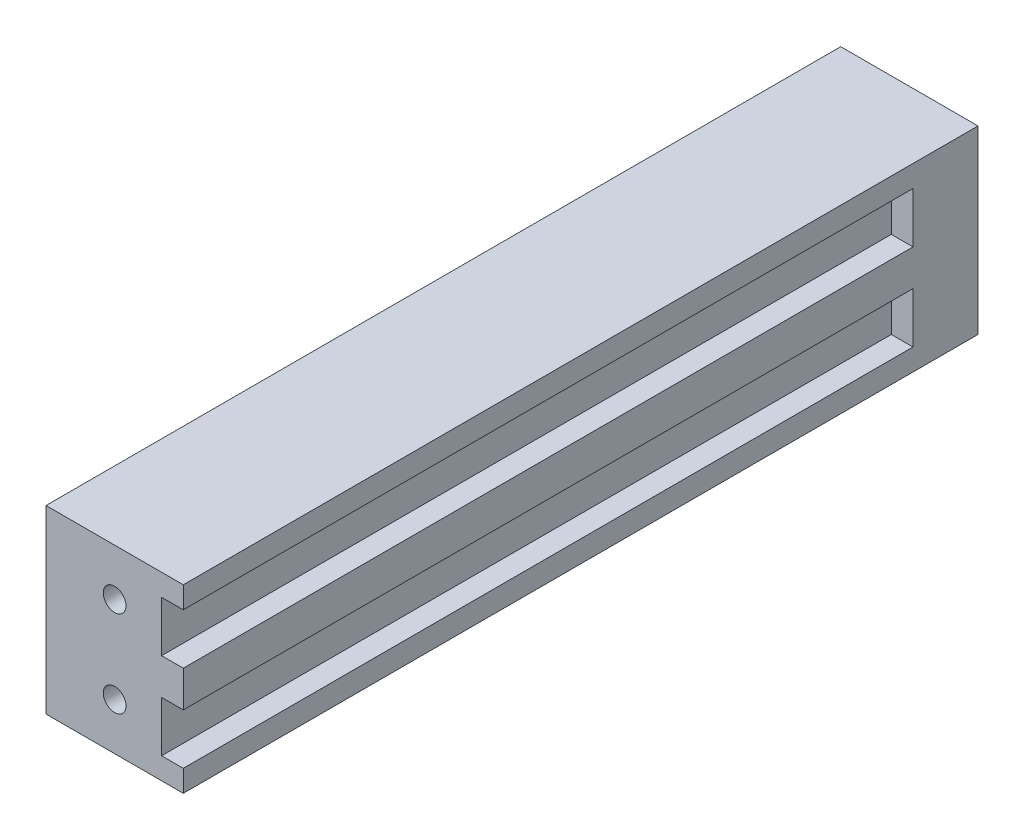
ISO-10303-21;
HEADER;
FILE_DESCRIPTION(('STEP AP214'),'2;1');
FILE_NAME('part.step','',(''),(''),'','','');
FILE_SCHEMA(('AUTOMOTIVE_DESIGN { 1 0 10303 214 1 1 1 1 }'));
ENDSEC;
DATA;
#1=APPLICATION_CONTEXT('core data for automotive mechanical design processes');
#2=APPLICATION_PROTOCOL_DEFINITION('international standard','automotive_design',2000,#1);
#3=PRODUCT_CONTEXT('',#1,'mechanical');
#4=PRODUCT('Part','Part','',(#3));
#5=PRODUCT_RELATED_PRODUCT_CATEGORY('part','',(#4));
#6=PRODUCT_DEFINITION_FORMATION('','',#4);
#7=PRODUCT_DEFINITION_CONTEXT('part definition',#1,'design');
#8=PRODUCT_DEFINITION('design','',#6,#7);
#9=PRODUCT_DEFINITION_SHAPE('','',#8);
#10=(LENGTH_UNIT() NAMED_UNIT(*) SI_UNIT(.MILLI.,.METRE.));
#11=(NAMED_UNIT(*) PLANE_ANGLE_UNIT() SI_UNIT($,.RADIAN.));
#12=(NAMED_UNIT(*) SI_UNIT($,.STERADIAN.) SOLID_ANGLE_UNIT());
#13=UNCERTAINTY_MEASURE_WITH_UNIT(LENGTH_MEASURE(1.E-05),#10,'distance_accuracy_value','');
#14=(GEOMETRIC_REPRESENTATION_CONTEXT(3) GLOBAL_UNCERTAINTY_ASSIGNED_CONTEXT((#13)) GLOBAL_UNIT_ASSIGNED_CONTEXT((#10,
#11,#12)) REPRESENTATION_CONTEXT('',''));
#15=CARTESIAN_POINT('',(0.,0.,0.));
#16=DIRECTION('',(0.,0.,1.));
#17=DIRECTION('',(1.,0.,0.));
#18=AXIS2_PLACEMENT_3D('',#15,#16,#17);
#19=CARTESIAN_POINT('',(-9.5,25.,55.));
#20=DIRECTION('',(1.,0.,0.));
#21=DIRECTION('',(0.,0.,-1.));
#22=AXIS2_PLACEMENT_3D('',#19,#20,#21);
#23=PLANE('',#22);
#24=CARTESIAN_POINT('',(-9.5,6.,51.));
#25=DIRECTION('',(-1.,0.,0.));
#26=DIRECTION('',(0.,0.,1.));
#27=AXIS2_PLACEMENT_3D('',#24,#25,#26);
#28=CIRCLE('',#27,1.5);
#29=CARTESIAN_POINT('',(-9.5,6.,52.5));
#30=VERTEX_POINT('',#29);
#31=EDGE_CURVE('E143',#30,#30,#28,.T.);
#32=ORIENTED_EDGE('',*,*,#31,.F.);
#33=EDGE_LOOP('',(#32));
#34=FACE_BOUND('',#33,.T.);
#35=CARTESIAN_POINT('',(-9.5,6.,-50.));
#36=DIRECTION('',(-1.,0.,0.));
#37=DIRECTION('',(0.,0.,1.));
#38=AXIS2_PLACEMENT_3D('',#35,#36,#37);
#39=CIRCLE('',#38,1.5);
#40=CARTESIAN_POINT('',(-9.5,6.,-48.5));
#41=VERTEX_POINT('',#40);
#42=EDGE_CURVE('E142',#41,#41,#39,.T.);
#43=ORIENTED_EDGE('',*,*,#42,.F.);
#44=EDGE_LOOP('',(#43));
#45=FACE_BOUND('',#44,.T.);
#46=DIRECTION('',(0.,0.,1.));
#47=VECTOR('',#46,1.);
#48=CARTESIAN_POINT('',(-9.5,0.,55.));
#49=LINE('',#48,#47);
#50=CARTESIAN_POINT('',(-9.5,0.,-55.));
#51=VERTEX_POINT('',#50);
#52=CARTESIAN_POINT('',(-9.5,0.,55.));
#53=VERTEX_POINT('',#52);
#54=EDGE_CURVE('E208',#51,#53,#49,.T.);
#55=ORIENTED_EDGE('',*,*,#54,.T.);
#56=DIRECTION('',(0.,-1.,0.));
#57=VECTOR('',#56,1.);
#58=CARTESIAN_POINT('',(-9.5,25.,55.));
#59=LINE('',#58,#57);
#60=CARTESIAN_POINT('',(-9.5,25.,55.));
#61=VERTEX_POINT('',#60);
#62=EDGE_CURVE('E46',#61,#53,#59,.T.);
#63=ORIENTED_EDGE('',*,*,#62,.F.);
#64=DIRECTION('',(0.,0.,1.));
#65=VECTOR('',#64,1.);
#66=CARTESIAN_POINT('',(-9.5,25.,55.));
#67=LINE('',#66,#65);
#68=CARTESIAN_POINT('',(-9.5,25.,-55.));
#69=VERTEX_POINT('',#68);
#70=EDGE_CURVE('E214',#69,#61,#67,.T.);
#71=ORIENTED_EDGE('',*,*,#70,.F.);
#72=DIRECTION('',(0.,-1.,0.));
#73=VECTOR('',#72,1.);
#74=CARTESIAN_POINT('',(-9.5,25.,-55.));
#75=LINE('',#74,#73);
#76=EDGE_CURVE('E224',#69,#51,#75,.T.);
#77=ORIENTED_EDGE('',*,*,#76,.T.);
#78=EDGE_LOOP('',(#55,#63,#71,#77));
#79=FACE_BOUND('',#78,.T.);
#80=ADVANCED_FACE('F34',(#34,#45,#79),#23,.F.);
#81=CARTESIAN_POINT('',(9.5,25.,55.));
#82=DIRECTION('',(0.,0.,-1.));
#83=DIRECTION('',(-1.,0.,0.));
#84=AXIS2_PLACEMENT_3D('',#81,#82,#83);
#85=PLANE('',#84);
#86=CARTESIAN_POINT('',(0.,6.5,55.));
#87=DIRECTION('',(0.,0.,1.));
#88=DIRECTION('',(-1.,0.,0.));
#89=AXIS2_PLACEMENT_3D('',#86,#87,#88);
#90=CIRCLE('',#89,1.575);
#91=CARTESIAN_POINT('',(-1.575,6.5,55.));
#92=VERTEX_POINT('',#91);
#93=EDGE_CURVE('E481',#92,#92,#90,.T.);
#94=ORIENTED_EDGE('',*,*,#93,.F.);
#95=EDGE_LOOP('',(#94));
#96=FACE_BOUND('',#95,.T.);
#97=CARTESIAN_POINT('',(0.,18.5,55.));
#98=DIRECTION('',(0.,0.,1.));
#99=DIRECTION('',(1.,0.,0.));
#100=AXIS2_PLACEMENT_3D('',#97,#98,#99);
#101=CIRCLE('',#100,1.575);
#102=CARTESIAN_POINT('',(1.575,18.5,55.));
#103=VERTEX_POINT('',#102);
#104=EDGE_CURVE('E138',#103,#103,#101,.T.);
#105=ORIENTED_EDGE('',*,*,#104,.F.);
#106=EDGE_LOOP('',(#105));
#107=FACE_BOUND('',#106,.T.);
#108=DIRECTION('',(0.,-1.,0.));
#109=VECTOR('',#108,1.);
#110=CARTESIAN_POINT('',(6.5,22.,55.));
#111=LINE('',#110,#109);
#112=CARTESIAN_POINT('',(6.5,22.,55.));
#113=VERTEX_POINT('',#112);
#114=CARTESIAN_POINT('',(6.5,15.,55.));
#115=VERTEX_POINT('',#114);
#116=EDGE_CURVE('E157',#113,#115,#111,.T.);
#117=ORIENTED_EDGE('',*,*,#116,.F.);
#118=DIRECTION('',(1.,0.,0.));
#119=VECTOR('',#118,1.);
#120=CARTESIAN_POINT('',(6.5,22.,55.));
#121=LINE('',#120,#119);
#122=CARTESIAN_POINT('',(9.5,22.,55.));
#123=VERTEX_POINT('',#122);
#124=EDGE_CURVE('E175',#113,#123,#121,.T.);
#125=ORIENTED_EDGE('',*,*,#124,.T.);
#126=DIRECTION('',(0.,-1.,0.));
#127=VECTOR('',#126,1.);
#128=CARTESIAN_POINT('',(9.5,25.,55.));
#129=LINE('',#128,#127);
#130=CARTESIAN_POINT('',(9.5,25.,55.));
#131=VERTEX_POINT('',#130);
#132=EDGE_CURVE('E239',#131,#123,#129,.T.);
#133=ORIENTED_EDGE('',*,*,#132,.F.);
#134=DIRECTION('',(1.,0.,0.));
#135=VECTOR('',#134,1.);
#136=CARTESIAN_POINT('',(9.5,25.,55.));
#137=LINE('',#136,#135);
#138=EDGE_CURVE('E217',#61,#131,#137,.T.);
#139=ORIENTED_EDGE('',*,*,#138,.F.);
#140=ORIENTED_EDGE('',*,*,#62,.T.);
#141=DIRECTION('',(1.,0.,0.));
#142=VECTOR('',#141,1.);
#143=CARTESIAN_POINT('',(9.5,0.,55.));
#144=LINE('',#143,#142);
#145=CARTESIAN_POINT('',(9.5,0.,55.));
#146=VERTEX_POINT('',#145);
#147=EDGE_CURVE('E227',#53,#146,#144,.T.);
#148=ORIENTED_EDGE('',*,*,#147,.T.);
#149=CARTESIAN_POINT('',(9.5,3.,55.));
#150=VERTEX_POINT('',#149);
#151=EDGE_CURVE('E238',#150,#146,#129,.T.);
#152=ORIENTED_EDGE('',*,*,#151,.F.);
#153=DIRECTION('',(1.,0.,0.));
#154=VECTOR('',#153,1.);
#155=CARTESIAN_POINT('',(6.5,3.,55.));
#156=LINE('',#155,#154);
#157=CARTESIAN_POINT('',(6.5,3.,55.));
#158=VERTEX_POINT('',#157);
#159=EDGE_CURVE('E197',#158,#150,#156,.T.);
#160=ORIENTED_EDGE('',*,*,#159,.F.);
#161=DIRECTION('',(0.,-1.,0.));
#162=VECTOR('',#161,1.);
#163=CARTESIAN_POINT('',(6.5,10.,55.));
#164=LINE('',#163,#162);
#165=CARTESIAN_POINT('',(6.5,10.,55.));
#166=VERTEX_POINT('',#165);
#167=EDGE_CURVE('E184',#166,#158,#164,.T.);
#168=ORIENTED_EDGE('',*,*,#167,.F.);
#169=DIRECTION('',(1.,0.,0.));
#170=VECTOR('',#169,1.);
#171=CARTESIAN_POINT('',(6.5,10.,55.));
#172=LINE('',#171,#170);
#173=CARTESIAN_POINT('',(9.5,10.,55.));
#174=VERTEX_POINT('',#173);
#175=EDGE_CURVE('E205',#166,#174,#172,.T.);
#176=ORIENTED_EDGE('',*,*,#175,.T.);
#177=CARTESIAN_POINT('',(9.5,15.,55.));
#178=VERTEX_POINT('',#177);
#179=EDGE_CURVE('E241',#178,#174,#129,.T.);
#180=ORIENTED_EDGE('',*,*,#179,.F.);
#181=DIRECTION('',(1.,0.,0.));
#182=VECTOR('',#181,1.);
#183=CARTESIAN_POINT('',(6.5,15.,55.));
#184=LINE('',#183,#182);
#185=EDGE_CURVE('E59',#115,#178,#184,.T.);
#186=ORIENTED_EDGE('',*,*,#185,.F.);
#187=EDGE_LOOP('',(#117,#125,#133,#139,#140,#148,#152,#160,#168,#176,#180,#186));
#188=FACE_BOUND('',#187,.T.);
#189=ADVANCED_FACE('F246',(#96,#107,#188),#85,.F.);
#190=CARTESIAN_POINT('',(9.5,25.,55.));
#191=DIRECTION('',(-1.,0.,0.));
#192=DIRECTION('',(0.,0.,1.));
#193=AXIS2_PLACEMENT_3D('',#190,#191,#192);
#194=PLANE('',#193);
#195=ORIENTED_EDGE('',*,*,#132,.T.);
#196=DIRECTION('',(0.,0.,1.));
#197=VECTOR('',#196,1.);
#198=CARTESIAN_POINT('',(9.5,22.,55.));
#199=LINE('',#198,#197);
#200=CARTESIAN_POINT('',(9.5,22.,-46.));
#201=VERTEX_POINT('',#200);
#202=EDGE_CURVE('E161',#201,#123,#199,.T.);
#203=ORIENTED_EDGE('',*,*,#202,.F.);
#204=DIRECTION('',(0.,1.,0.));
#205=VECTOR('',#204,1.);
#206=CARTESIAN_POINT('',(9.5,22.,-46.));
#207=LINE('',#206,#205);
#208=CARTESIAN_POINT('',(9.5,15.,-46.));
#209=VERTEX_POINT('',#208);
#210=EDGE_CURVE('E171',#209,#201,#207,.T.);
#211=ORIENTED_EDGE('',*,*,#210,.F.);
#212=DIRECTION('',(0.,0.,-1.));
#213=VECTOR('',#212,1.);
#214=CARTESIAN_POINT('',(9.5,15.,55.));
#215=LINE('',#214,#213);
#216=EDGE_CURVE('E155',#178,#209,#215,.T.);
#217=ORIENTED_EDGE('',*,*,#216,.F.);
#218=ORIENTED_EDGE('',*,*,#179,.T.);
#219=DIRECTION('',(0.,0.,1.));
#220=VECTOR('',#219,1.);
#221=CARTESIAN_POINT('',(9.5,10.,55.));
#222=LINE('',#221,#220);
#223=CARTESIAN_POINT('',(9.5,10.,-46.));
#224=VERTEX_POINT('',#223);
#225=EDGE_CURVE('E188',#224,#174,#222,.T.);
#226=ORIENTED_EDGE('',*,*,#225,.F.);
#227=DIRECTION('',(0.,1.,0.));
#228=VECTOR('',#227,1.);
#229=CARTESIAN_POINT('',(9.5,10.,-46.));
#230=LINE('',#229,#228);
#231=CARTESIAN_POINT('',(9.5,3.,-46.));
#232=VERTEX_POINT('',#231);
#233=EDGE_CURVE('E200',#232,#224,#230,.T.);
#234=ORIENTED_EDGE('',*,*,#233,.F.);
#235=DIRECTION('',(0.,0.,-1.));
#236=VECTOR('',#235,1.);
#237=CARTESIAN_POINT('',(9.5,3.,55.));
#238=LINE('',#237,#236);
#239=EDGE_CURVE('E178',#150,#232,#238,.T.);
#240=ORIENTED_EDGE('',*,*,#239,.F.);
#241=ORIENTED_EDGE('',*,*,#151,.T.);
#242=DIRECTION('',(0.,0.,-1.));
#243=VECTOR('',#242,1.);
#244=CARTESIAN_POINT('',(9.5,0.,55.));
#245=LINE('',#244,#243);
#246=CARTESIAN_POINT('',(9.5,0.,-55.));
#247=VERTEX_POINT('',#246);
#248=EDGE_CURVE('E230',#146,#247,#245,.T.);
#249=ORIENTED_EDGE('',*,*,#248,.T.);
#250=DIRECTION('',(0.,-1.,0.));
#251=VECTOR('',#250,1.);
#252=CARTESIAN_POINT('',(9.5,25.,-55.));
#253=LINE('',#252,#251);
#254=CARTESIAN_POINT('',(9.5,25.,-55.));
#255=VERTEX_POINT('',#254);
#256=EDGE_CURVE('E235',#255,#247,#253,.T.);
#257=ORIENTED_EDGE('',*,*,#256,.F.);
#258=DIRECTION('',(0.,0.,-1.));
#259=VECTOR('',#258,1.);
#260=CARTESIAN_POINT('',(9.5,25.,55.));
#261=LINE('',#260,#259);
#262=EDGE_CURVE('E220',#131,#255,#261,.T.);
#263=ORIENTED_EDGE('',*,*,#262,.F.);
#264=EDGE_LOOP('',(#195,#203,#211,#217,#218,#226,#234,#240,#241,#249,#257,#263));
#265=FACE_BOUND('',#264,.T.);
#266=ADVANCED_FACE('F259',(#265),#194,.F.);
#267=CARTESIAN_POINT('',(9.5,25.,-55.));
#268=DIRECTION('',(0.,0.,1.));
#269=DIRECTION('',(1.,0.,0.));
#270=AXIS2_PLACEMENT_3D('',#267,#268,#269);
#271=PLANE('',#270);
#272=DIRECTION('',(-1.,0.,0.));
#273=VECTOR('',#272,1.);
#274=CARTESIAN_POINT('',(9.5,0.,-55.));
#275=LINE('',#274,#273);
#276=EDGE_CURVE('E218',#247,#51,#275,.T.);
#277=ORIENTED_EDGE('',*,*,#276,.T.);
#278=ORIENTED_EDGE('',*,*,#76,.F.);
#279=DIRECTION('',(-1.,0.,0.));
#280=VECTOR('',#279,1.);
#281=CARTESIAN_POINT('',(9.5,25.,-55.));
#282=LINE('',#281,#280);
#283=EDGE_CURVE('E222',#255,#69,#282,.T.);
#284=ORIENTED_EDGE('',*,*,#283,.F.);
#285=ORIENTED_EDGE('',*,*,#256,.T.);
#286=EDGE_LOOP('',(#277,#278,#284,#285));
#287=FACE_BOUND('',#286,.T.);
#288=ADVANCED_FACE('F264',(#287),#271,.F.);
#289=CARTESIAN_POINT('',(0.,25.,0.));
#290=DIRECTION('',(0.,1.,0.));
#291=DIRECTION('',(0.,0.,1.));
#292=AXIS2_PLACEMENT_3D('',#289,#290,#291);
#293=PLANE('',#292);
#294=ORIENTED_EDGE('',*,*,#70,.T.);
#295=ORIENTED_EDGE('',*,*,#138,.T.);
#296=ORIENTED_EDGE('',*,*,#262,.T.);
#297=ORIENTED_EDGE('',*,*,#283,.T.);
#298=EDGE_LOOP('',(#294,#295,#296,#297));
#299=FACE_BOUND('',#298,.T.);
#300=ADVANCED_FACE('F266',(#299),#293,.T.);
#301=CARTESIAN_POINT('',(0.,0.,0.));
#302=DIRECTION('',(0.,1.,0.));
#303=DIRECTION('',(0.,0.,1.));
#304=AXIS2_PLACEMENT_3D('',#301,#302,#303);
#305=PLANE('',#304);
#306=ORIENTED_EDGE('',*,*,#54,.F.);
#307=ORIENTED_EDGE('',*,*,#276,.F.);
#308=ORIENTED_EDGE('',*,*,#248,.F.);
#309=ORIENTED_EDGE('',*,*,#147,.F.);
#310=EDGE_LOOP('',(#306,#307,#308,#309));
#311=FACE_BOUND('',#310,.T.);
#312=ADVANCED_FACE('F256',(#311),#305,.F.);
#313=CARTESIAN_POINT('',(6.5,10.,55.));
#314=DIRECTION('',(0.,1.,0.));
#315=DIRECTION('',(0.,0.,1.));
#316=AXIS2_PLACEMENT_3D('',#313,#314,#315);
#317=PLANE('',#316);
#318=ORIENTED_EDGE('',*,*,#225,.T.);
#319=ORIENTED_EDGE('',*,*,#175,.F.);
#320=DIRECTION('',(0.,0.,1.));
#321=VECTOR('',#320,1.);
#322=CARTESIAN_POINT('',(6.5,10.,55.));
#323=LINE('',#322,#321);
#324=CARTESIAN_POINT('',(6.5,10.,-46.));
#325=VERTEX_POINT('',#324);
#326=EDGE_CURVE('E194',#325,#166,#323,.T.);
#327=ORIENTED_EDGE('',*,*,#326,.F.);
#328=DIRECTION('',(1.,0.,0.));
#329=VECTOR('',#328,1.);
#330=CARTESIAN_POINT('',(6.5,10.,-46.));
#331=LINE('',#330,#329);
#332=EDGE_CURVE('E209',#325,#224,#331,.T.);
#333=ORIENTED_EDGE('',*,*,#332,.T.);
#334=EDGE_LOOP('',(#318,#319,#327,#333));
#335=FACE_BOUND('',#334,.T.);
#336=ADVANCED_FACE('F283',(#335),#317,.F.);
#337=CARTESIAN_POINT('',(6.5,10.,-46.));
#338=DIRECTION('',(0.,0.,-1.));
#339=DIRECTION('',(-1.,0.,0.));
#340=AXIS2_PLACEMENT_3D('',#337,#338,#339);
#341=PLANE('',#340);
#342=ORIENTED_EDGE('',*,*,#233,.T.);
#343=ORIENTED_EDGE('',*,*,#332,.F.);
#344=DIRECTION('',(0.,1.,0.));
#345=VECTOR('',#344,1.);
#346=CARTESIAN_POINT('',(6.5,10.,-46.));
#347=LINE('',#346,#345);
#348=CARTESIAN_POINT('',(6.5,3.,-46.));
#349=VERTEX_POINT('',#348);
#350=EDGE_CURVE('E191',#349,#325,#347,.T.);
#351=ORIENTED_EDGE('',*,*,#350,.F.);
#352=DIRECTION('',(1.,0.,0.));
#353=VECTOR('',#352,1.);
#354=CARTESIAN_POINT('',(6.5,3.,-46.));
#355=LINE('',#354,#353);
#356=EDGE_CURVE('E211',#349,#232,#355,.T.);
#357=ORIENTED_EDGE('',*,*,#356,.T.);
#358=EDGE_LOOP('',(#342,#343,#351,#357));
#359=FACE_BOUND('',#358,.T.);
#360=ADVANCED_FACE('F288',(#359),#341,.F.);
#361=CARTESIAN_POINT('',(6.5,3.,55.));
#362=DIRECTION('',(0.,-1.,0.));
#363=DIRECTION('',(0.,0.,-1.));
#364=AXIS2_PLACEMENT_3D('',#361,#362,#363);
#365=PLANE('',#364);
#366=ORIENTED_EDGE('',*,*,#239,.T.);
#367=ORIENTED_EDGE('',*,*,#356,.F.);
#368=DIRECTION('',(0.,0.,-1.));
#369=VECTOR('',#368,1.);
#370=CARTESIAN_POINT('',(6.5,3.,55.));
#371=LINE('',#370,#369);
#372=EDGE_CURVE('E187',#158,#349,#371,.T.);
#373=ORIENTED_EDGE('',*,*,#372,.F.);
#374=ORIENTED_EDGE('',*,*,#159,.T.);
#375=EDGE_LOOP('',(#366,#367,#373,#374));
#376=FACE_BOUND('',#375,.T.);
#377=ADVANCED_FACE('F291',(#376),#365,.F.);
#378=CARTESIAN_POINT('',(6.5,0.,0.));
#379=DIRECTION('',(1.,0.,0.));
#380=DIRECTION('',(0.,0.,-1.));
#381=AXIS2_PLACEMENT_3D('',#378,#379,#380);
#382=PLANE('',#381);
#383=ORIENTED_EDGE('',*,*,#167,.T.);
#384=ORIENTED_EDGE('',*,*,#372,.T.);
#385=ORIENTED_EDGE('',*,*,#350,.T.);
#386=ORIENTED_EDGE('',*,*,#326,.T.);
#387=EDGE_LOOP('',(#383,#384,#385,#386));
#388=FACE_BOUND('',#387,.T.);
#389=ADVANCED_FACE('F285',(#388),#382,.T.);
#390=CARTESIAN_POINT('',(6.5,22.,55.));
#391=DIRECTION('',(0.,1.,0.));
#392=DIRECTION('',(0.,0.,1.));
#393=AXIS2_PLACEMENT_3D('',#390,#391,#392);
#394=PLANE('',#393);
#395=ORIENTED_EDGE('',*,*,#202,.T.);
#396=ORIENTED_EDGE('',*,*,#124,.F.);
#397=DIRECTION('',(0.,0.,1.));
#398=VECTOR('',#397,1.);
#399=CARTESIAN_POINT('',(6.5,22.,55.));
#400=LINE('',#399,#398);
#401=CARTESIAN_POINT('',(6.5,22.,-46.));
#402=VERTEX_POINT('',#401);
#403=EDGE_CURVE('E167',#402,#113,#400,.T.);
#404=ORIENTED_EDGE('',*,*,#403,.F.);
#405=DIRECTION('',(1.,0.,0.));
#406=VECTOR('',#405,1.);
#407=CARTESIAN_POINT('',(6.5,22.,-46.));
#408=LINE('',#407,#406);
#409=EDGE_CURVE('E179',#402,#201,#408,.T.);
#410=ORIENTED_EDGE('',*,*,#409,.T.);
#411=EDGE_LOOP('',(#395,#396,#404,#410));
#412=FACE_BOUND('',#411,.T.);
#413=ADVANCED_FACE('F271',(#412),#394,.F.);
#414=CARTESIAN_POINT('',(6.5,22.,-46.));
#415=DIRECTION('',(0.,0.,-1.));
#416=DIRECTION('',(-1.,0.,0.));
#417=AXIS2_PLACEMENT_3D('',#414,#415,#416);
#418=PLANE('',#417);
#419=ORIENTED_EDGE('',*,*,#210,.T.);
#420=ORIENTED_EDGE('',*,*,#409,.F.);
#421=DIRECTION('',(0.,1.,0.));
#422=VECTOR('',#421,1.);
#423=CARTESIAN_POINT('',(6.5,22.,-46.));
#424=LINE('',#423,#422);
#425=CARTESIAN_POINT('',(6.5,15.,-46.));
#426=VERTEX_POINT('',#425);
#427=EDGE_CURVE('E164',#426,#402,#424,.T.);
#428=ORIENTED_EDGE('',*,*,#427,.F.);
#429=DIRECTION('',(1.,0.,0.));
#430=VECTOR('',#429,1.);
#431=CARTESIAN_POINT('',(6.5,15.,-46.));
#432=LINE('',#431,#430);
#433=EDGE_CURVE('E181',#426,#209,#432,.T.);
#434=ORIENTED_EDGE('',*,*,#433,.T.);
#435=EDGE_LOOP('',(#419,#420,#428,#434));
#436=FACE_BOUND('',#435,.T.);
#437=ADVANCED_FACE('F276',(#436),#418,.F.);
#438=CARTESIAN_POINT('',(6.5,15.,55.));
#439=DIRECTION('',(0.,-1.,0.));
#440=DIRECTION('',(0.,0.,-1.));
#441=AXIS2_PLACEMENT_3D('',#438,#439,#440);
#442=PLANE('',#441);
#443=ORIENTED_EDGE('',*,*,#216,.T.);
#444=ORIENTED_EDGE('',*,*,#433,.F.);
#445=DIRECTION('',(0.,0.,-1.));
#446=VECTOR('',#445,1.);
#447=CARTESIAN_POINT('',(6.5,15.,55.));
#448=LINE('',#447,#446);
#449=EDGE_CURVE('E160',#115,#426,#448,.T.);
#450=ORIENTED_EDGE('',*,*,#449,.F.);
#451=ORIENTED_EDGE('',*,*,#185,.T.);
#452=EDGE_LOOP('',(#443,#444,#450,#451));
#453=FACE_BOUND('',#452,.T.);
#454=ADVANCED_FACE('F322',(#453),#442,.F.);
#455=CARTESIAN_POINT('',(6.5,0.,0.));
#456=DIRECTION('',(1.,0.,0.));
#457=DIRECTION('',(0.,0.,-1.));
#458=AXIS2_PLACEMENT_3D('',#455,#456,#457);
#459=PLANE('',#458);
#460=ORIENTED_EDGE('',*,*,#116,.T.);
#461=ORIENTED_EDGE('',*,*,#449,.T.);
#462=ORIENTED_EDGE('',*,*,#427,.T.);
#463=ORIENTED_EDGE('',*,*,#403,.T.);
#464=EDGE_LOOP('',(#460,#461,#462,#463));
#465=FACE_BOUND('',#464,.T.);
#466=ADVANCED_FACE('F273',(#465),#459,.T.);
#467=CARTESIAN_POINT('',(0.5,6.,-50.));
#468=DIRECTION('',(-1.,0.,0.));
#469=DIRECTION('',(0.,0.,1.));
#470=AXIS2_PLACEMENT_3D('',#467,#468,#469);
#471=CYLINDRICAL_SURFACE('',#470,1.5);
#472=CARTESIAN_POINT('',(0.5,6.,-50.));
#473=DIRECTION('',(-1.,0.,0.));
#474=DIRECTION('',(0.,0.,1.));
#475=AXIS2_PLACEMENT_3D('',#472,#473,#474);
#476=CIRCLE('',#475,1.5);
#477=CARTESIAN_POINT('',(0.5,6.,-48.5));
#478=VERTEX_POINT('',#477);
#479=EDGE_CURVE('E146',#478,#478,#476,.T.);
#480=ORIENTED_EDGE('',*,*,#479,.F.);
#481=EDGE_LOOP('',(#480));
#482=FACE_BOUND('',#481,.T.);
#483=ORIENTED_EDGE('',*,*,#42,.T.);
#484=EDGE_LOOP('',(#483));
#485=FACE_BOUND('',#484,.T.);
#486=ADVANCED_FACE('F311',(#482,#485),#471,.F.);
#487=CARTESIAN_POINT('',(0.5,6.,-50.));
#488=DIRECTION('',(-1.,0.,0.));
#489=DIRECTION('',(0.,0.,1.));
#490=AXIS2_PLACEMENT_3D('',#487,#488,#489);
#491=PLANE('',#490);
#492=ORIENTED_EDGE('',*,*,#479,.T.);
#493=EDGE_LOOP('',(#492));
#494=FACE_BOUND('',#493,.T.);
#495=ADVANCED_FACE('F313',(#494),#491,.T.);
#496=CARTESIAN_POINT('',(0.5,6.,51.));
#497=DIRECTION('',(-1.,0.,0.));
#498=DIRECTION('',(0.,0.,1.));
#499=AXIS2_PLACEMENT_3D('',#496,#497,#498);
#500=CYLINDRICAL_SURFACE('',#499,1.5);
#501=CARTESIAN_POINT('',(0.5,6.,51.));
#502=DIRECTION('',(-1.,0.,0.));
#503=DIRECTION('',(0.,0.,1.));
#504=AXIS2_PLACEMENT_3D('',#501,#502,#503);
#505=CIRCLE('',#504,1.5);
#506=CARTESIAN_POINT('',(0.5,5.10255573747064,49.7980874425928));
#507=VERTEX_POINT('',#506);
#508=CARTESIAN_POINT('',(0.5,5.05869876463996,52.1678835491226));
#509=VERTEX_POINT('',#508);
#510=EDGE_CURVE('E137',#507,#509,#505,.T.);
#511=ORIENTED_EDGE('',*,*,#510,.F.);
#512=CARTESIAN_POINT('',(0.5002,5.10262831749637,49.7980332519406));
#513=CARTESIAN_POINT('',(0.469801252137214,5.09159659360616,49.806269777566));
#514=CARTESIAN_POINT('',(0.438929284418992,5.08152327476734,49.8140260082759));
#515=CARTESIAN_POINT('',(0.376289791777142,5.06337541317052,49.8283058359672));
#516=CARTESIAN_POINT('',(0.344521347223774,5.05530301266987,49.8348281100761));
#517=CARTESIAN_POINT('',(0.248177841090172,5.0342714104095,49.8520863010183));
#518=CARTESIAN_POINT('',(0.18243987397653,5.02445205283101,49.860549474107));
#519=CARTESIAN_POINT('',(0.0492683237037966,5.01385712625378,49.8696996106478));
#520=CARTESIAN_POINT('',(-0.0181732788103043,5.01313835597361,49.8703377355173));
#521=CARTESIAN_POINT('',(-0.151999006032028,5.02093465641677,49.8635795004487));
#522=CARTESIAN_POINT('',(-0.218384258959907,5.02943909574575,49.8561923910077));
#523=CARTESIAN_POINT('',(-0.358359778629389,5.05704980969524,49.8332925768071));
#524=CARTESIAN_POINT('',(-0.431481240358482,5.07758947325443,49.816701965964));
#525=CARTESIAN_POINT('',(-0.572656815124803,5.12902684282095,49.7783500268974));
#526=CARTESIAN_POINT('',(-0.640695526226845,5.1599545852941,49.7565737584321));
#527=CARTESIAN_POINT('',(-0.772122443833957,5.23197939818583,49.710814077313));
#528=CARTESIAN_POINT('',(-0.835400236553225,5.27325538987531,49.6867970724983));
#529=CARTESIAN_POINT('',(-0.955208073199952,5.36512837656273,49.6400023656343));
#530=CARTESIAN_POINT('',(-1.01174547576432,5.41571505045477,49.6172233271362));
#531=CARTESIAN_POINT('',(-1.11396236520237,5.52244499002089,49.5769775481019));
#532=CARTESIAN_POINT('',(-1.16009367360474,5.57806147205068,49.5592716049479));
#533=CARTESIAN_POINT('',(-1.24442960557784,5.69648364335251,49.5297637414203));
#534=CARTESIAN_POINT('',(-1.28263670070767,5.75928708150343,49.5179599785334));
#535=CARTESIAN_POINT('',(-1.3500379605668,5.8913193803248,49.5024554215301));
#536=CARTESIAN_POINT('',(-1.37914575637012,5.96060215637844,49.4988303588571));
#537=CARTESIAN_POINT('',(-1.42658026314406,6.10254119983047,49.5018342201377));
#538=CARTESIAN_POINT('',(-1.44492044409894,6.17519312915597,49.5084502948551));
#539=CARTESIAN_POINT('',(-1.46853021438352,6.30932211642335,49.5309130689167));
#540=CARTESIAN_POINT('',(-1.47537863110471,6.370795713364,49.5451799600313));
#541=CARTESIAN_POINT('',(-1.48163532495224,6.4917810521847,49.5815011709464));
#542=CARTESIAN_POINT('',(-1.48104265477371,6.55129254330736,49.6035564819224));
#543=CARTESIAN_POINT('',(-1.4735008557818,6.66563144049424,49.6543463153861));
#544=CARTESIAN_POINT('',(-1.46666592006401,6.72052371265414,49.6829539525498));
#545=CARTESIAN_POINT('',(-1.44807180443294,6.82574586652671,49.7462387054002));
#546=CARTESIAN_POINT('',(-1.43631178147949,6.8760749653539,49.7809168596017));
#547=CARTESIAN_POINT('',(-1.40716017594519,6.9788481943554,49.8612565975007));
#548=CARTESIAN_POINT('',(-1.38918323468068,7.03044414255766,49.9077866782892));
#549=CARTESIAN_POINT('',(-1.35058174894238,7.12633265098076,50.0069522137547));
#550=CARTESIAN_POINT('',(-1.32995329576125,7.17061420399982,50.0595966706229));
#551=CARTESIAN_POINT('',(-1.28378397274894,7.26007808669341,50.1820099918236));
#552=CARTESIAN_POINT('',(-1.25812582126974,7.30347508980961,50.2530471948836));
#553=CARTESIAN_POINT('',(-1.21031207315204,7.37828416262527,50.4022716736326));
#554=CARTESIAN_POINT('',(-1.18815287333502,7.40970860927796,50.4804514612222));
#555=CARTESIAN_POINT('',(-1.15634930930324,7.45355278179541,50.6239339651652));
#556=CARTESIAN_POINT('',(-1.1449940889995,7.46869043340205,50.6880150492644));
#557=CARTESIAN_POINT('',(-1.12928289035721,7.49042391957333,50.8183835871048));
#558=CARTESIAN_POINT('',(-1.12491256755994,7.49703725458524,50.8846662329537));
#559=CARTESIAN_POINT('',(-1.12416710897885,7.50137520876599,51.0177493318944));
#560=CARTESIAN_POINT('',(-1.12781289454932,7.49907655646467,51.0845506854558));
#561=CARTESIAN_POINT('',(-1.1424900124786,7.48577979180251,51.2165018479682));
#562=CARTESIAN_POINT('',(-1.15353403527999,7.47476672542489,51.2816486191254));
#563=CARTESIAN_POINT('',(-1.18454285077591,7.44097136555715,51.424564015946));
#564=CARTESIAN_POINT('',(-1.20604030245671,7.41594845789188,51.5014585909884));
#565=CARTESIAN_POINT('',(-1.2533735136501,7.35460964309968,51.6491968243576));
#566=CARTESIAN_POINT('',(-1.27921717349402,7.31827306622125,51.720029102602));
#567=CARTESIAN_POINT('',(-1.3320295857637,7.23417017700569,51.8563706378062));
#568=CARTESIAN_POINT('',(-1.35901056759637,7.18617998441263,51.921736974612));
#569=CARTESIAN_POINT('',(-1.41005561220375,7.07965864905251,52.0444713889582));
#570=CARTESIAN_POINT('',(-1.43412378304514,7.02114264807083,52.1018507484622));
#571=CARTESIAN_POINT('',(-1.472447478931,6.90490851323248,52.1982629164751));
#572=CARTESIAN_POINT('',(-1.48767419739292,6.84872984808476,52.238757311435));
#573=CARTESIAN_POINT('',(-1.51183440313949,6.73029163296895,52.3120643552315));
#574=CARTESIAN_POINT('',(-1.5207718223989,6.66803591006062,52.3448817950009));
#575=CARTESIAN_POINT('',(-1.53055585299663,6.53841273969261,52.4018402256301));
#576=CARTESIAN_POINT('',(-1.53133785033284,6.47100872538636,52.4259104693251));
#577=CARTESIAN_POINT('',(-1.52324859101415,6.3339932369296,52.4640673605245));
#578=CARTESIAN_POINT('',(-1.51438474972653,6.2643834983746,52.478161663428));
#579=CARTESIAN_POINT('',(-1.4883767055284,6.13483848135833,52.4951696051719));
#580=CARTESIAN_POINT('',(-1.47244413197813,6.07481041458662,52.4992881187536));
#581=CARTESIAN_POINT('',(-1.43326239471263,5.9571328544764,52.5005418145837));
#582=CARTESIAN_POINT('',(-1.41001222545196,5.89948368926623,52.4976760367225));
#583=CARTESIAN_POINT('',(-1.35657354651498,5.78730139930406,52.4859286652299));
#584=CARTESIAN_POINT('',(-1.32630176925587,5.73281635549968,52.4769721616169));
#585=CARTESIAN_POINT('',(-1.25986310341548,5.62868249668077,52.4542931436037));
#586=CARTESIAN_POINT('',(-1.22369382351761,5.57903565655991,52.4405686933357));
#587=CARTESIAN_POINT('',(-1.12961826531988,5.46490229038754,52.4030896460729));
#588=CARTESIAN_POINT('',(-1.06904454924041,5.40318988902209,52.3775581850825));
#589=CARTESIAN_POINT('',(-0.939074485532392,5.2912085099408,52.3234424713597));
#590=CARTESIAN_POINT('',(-0.869651146152822,5.24097591319016,52.2948489236777));
#591=CARTESIAN_POINT('',(-0.722052834977222,5.15193339235596,52.2383821634949));
#592=CARTESIAN_POINT('',(-0.643768656777387,5.11329377909899,52.2105247050096));
#593=CARTESIAN_POINT('',(-0.480256230997025,5.04949170930069,52.1611082159777));
#594=CARTESIAN_POINT('',(-0.395061187366792,5.02426875262265,52.1395211139698));
#595=CARTESIAN_POINT('',(-0.243948331608082,4.99365790318215,52.1124617998853));
#596=CARTESIAN_POINT('',(-0.179264552749147,4.98470335891037,52.1041766879554));
#597=CARTESIAN_POINT('',(-0.0486306611871204,4.97507550572677,52.0952545417431));
#598=CARTESIAN_POINT('',(0.0173204199137947,4.97440880419841,52.0946236096736));
#599=CARTESIAN_POINT('',(0.118728560777749,4.97982684202281,52.0996568401932));
#600=CARTESIAN_POINT('',(0.154526311339127,4.98300279911718,52.1026107219716));
#601=CARTESIAN_POINT('',(0.225604433756262,4.99179405368684,52.1106565958705));
#602=CARTESIAN_POINT('',(0.260884504349487,4.99741071752623,52.1157497855716));
#603=CARTESIAN_POINT('',(0.33076147713339,5.01101201235843,52.1278232521016));
#604=CARTESIAN_POINT('',(0.36535593174491,5.01900390604521,52.1348093108458));
#605=CARTESIAN_POINT('',(0.433549592987961,5.03723096400298,52.1503115011951));
#606=CARTESIAN_POINT('',(0.467150058326397,5.04746314005956,52.1588255919236));
#607=CARTESIAN_POINT('',(0.500199999999996,5.05876714370946,52.1679386585945));
#608=B_SPLINE_CURVE_WITH_KNOTS('',3,(#512,#513,#514,#515,#516,#517,#518,#519,#520,#521,#522,
#523,#524,#525,#526,#527,#528,#529,#530,#531,#532,#533,#534,#535,#536,#537,#538,#539,#540,#541,
#542,#543,#544,#545,#546,#547,#548,#549,#550,#551,#552,#553,#554,#555,#556,#557,#558,#559,#560,
#561,#562,#563,#564,#565,#566,#567,#568,#569,#570,#571,#572,#573,#574,#575,#576,#577,#578,#579,
#580,#581,#582,#583,#584,#585,#586,#587,#588,#589,#590,#591,#592,#593,#594,#595,#596,#597,#598,
#599,#600,#601,#602,#603,#604,#605,#606,#607),.UNSPECIFIED.,.F.,.F.,(4,2,2,2,2,2,2,2,2,2,2,2,2,
2,2,2,2,2,2,2,2,2,2,2,2,2,2,2,2,2,2,2,2,2,2,2,2,2,2,2,2,2,2,2,2,2,2,4),(0.,0.100076606880788,
0.200259901130056,0.400218128499672,0.601423727320521,0.802397647059144,1.0343819336087,
1.26704284639701,1.5040434186108,1.74078283546931,1.9630892529458,2.18532622851535,
2.40961272718436,2.6336180485779,2.82309901573583,3.01260410545355,3.19871044013115,
3.38484864415012,3.59937655453311,3.81422441660086,4.07445264124568,4.3344111132465,
4.53404629089276,4.73327096068938,4.93301620681084,5.13310496295104,5.3827901487354,
5.63293420577952,5.88832826331305,6.14335782268494,6.35524665744043,6.56700290452827,
6.78043559722834,6.99370432653264,7.17954296105372,7.36540714369867,7.55359963357165,
7.74186862228202,8.0109273570936,8.28082730090745,8.55451736703187,8.82696258102571,
9.02358188884933,9.22035793902018,9.32840430251589,9.43651123094752,9.54495217753685,
9.65324935127265),.UNSPECIFIED.);
#609=EDGE_CURVE('E51',#507,#509,#608,.T.);
#610=ORIENTED_EDGE('',*,*,#609,.T.);
#611=EDGE_LOOP('',(#511,#610));
#612=FACE_BOUND('',#611,.T.);
#613=ORIENTED_EDGE('',*,*,#31,.T.);
#614=EDGE_LOOP('',(#613));
#615=FACE_BOUND('',#614,.T.);
#616=ADVANCED_FACE('F135',(#612,#615),#500,.F.);
#617=CARTESIAN_POINT('',(0.5,6.,51.));
#618=DIRECTION('',(-1.,0.,0.));
#619=DIRECTION('',(0.,0.,1.));
#620=AXIS2_PLACEMENT_3D('',#617,#618,#619);
#621=PLANE('',#620);
#622=CARTESIAN_POINT('',(0.5,5.15542226507795,46.9527379640053));
#623=CARTESIAN_POINT('',(0.5,5.13729947443751,47.9259120689865));
#624=CARTESIAN_POINT('',(0.5,5.11922029744683,48.8990869847411));
#625=CARTESIAN_POINT('',(0.5,5.08314110635719,50.8454382836646));
#626=CARTESIAN_POINT('',(0.5,5.06514109225821,51.8186146668335));
#627=CARTESIAN_POINT('',(0.5,5.00200496739078,55.2388460843841));
#628=CARTESIAN_POINT('',(0.5,4.95705807505508,57.6859046145391));
#629=CARTESIAN_POINT('',(0.5,4.91227184450555,60.132966072984));
#630=B_SPLINE_CURVE_WITH_KNOTS('',3,(#622,#623,#624,#625,#626,#627,#628,#629),.UNSPECIFIED.,.F.,
.F.,(4,2,2,4),(0.,2.92002850113347,5.84005700189318,13.1824707995242),.UNSPECIFIED.);
#631=EDGE_CURVE('E11',#507,#509,#630,.T.);
#632=ORIENTED_EDGE('',*,*,#631,.F.);
#633=ORIENTED_EDGE('',*,*,#510,.T.);
#634=EDGE_LOOP('',(#632,#633));
#635=FACE_BOUND('',#634,.T.);
#636=ADVANCED_FACE('F141',(#635),#621,.T.);
#637=CARTESIAN_POINT('',(0.,18.5,55.));
#638=DIRECTION('',(0.,0.,1.));
#639=DIRECTION('',(1.,0.,0.));
#640=AXIS2_PLACEMENT_3D('',#637,#638,#639);
#641=CONICAL_SURFACE('',#640,1.575,0.0174532925199433);
#642=CARTESIAN_POINT('',(0.,18.5,40.));
#643=DIRECTION('',(0.,0.,1.));
#644=DIRECTION('',(1.,0.,0.));
#645=AXIS2_PLACEMENT_3D('',#642,#643,#644);
#646=CIRCLE('',#645,1.31317402607674);
#647=CARTESIAN_POINT('',(1.31317402607674,18.5,40.));
#648=VERTEX_POINT('',#647);
#649=EDGE_CURVE('E149',#648,#648,#646,.T.);
#650=ORIENTED_EDGE('',*,*,#649,.F.);
#651=EDGE_LOOP('',(#650));
#652=FACE_BOUND('',#651,.T.);
#653=ORIENTED_EDGE('',*,*,#104,.T.);
#654=EDGE_LOOP('',(#653));
#655=FACE_BOUND('',#654,.T.);
#656=ADVANCED_FACE('F424',(#652,#655),#641,.F.);
#657=CARTESIAN_POINT('',(0.,18.5,40.));
#658=DIRECTION('',(0.,0.,1.));
#659=DIRECTION('',(1.,0.,0.));
#660=AXIS2_PLACEMENT_3D('',#657,#658,#659);
#661=PLANE('',#660);
#662=ORIENTED_EDGE('',*,*,#649,.T.);
#663=EDGE_LOOP('',(#662));
#664=FACE_BOUND('',#663,.T.);
#665=ADVANCED_FACE('F431',(#664),#661,.T.);
#666=CARTESIAN_POINT('',(0.,6.5,55.));
#667=DIRECTION('',(0.,0.,1.));
#668=DIRECTION('',(-1.,0.,0.));
#669=AXIS2_PLACEMENT_3D('',#666,#667,#668);
#670=CONICAL_SURFACE('',#669,1.575,0.0174532925199433);
#671=ORIENTED_EDGE('',*,*,#93,.T.);
#672=EDGE_LOOP('',(#671));
#673=FACE_BOUND('',#672,.T.);
#674=CARTESIAN_POINT('',(0.,6.5,40.));
#675=DIRECTION('',(0.,0.,-1.));
#676=DIRECTION('',(-1.,0.,0.));
#677=AXIS2_PLACEMENT_3D('',#674,#675,#676);
#678=CIRCLE('',#677,1.31317402607674);
#679=CARTESIAN_POINT('',(-1.31317402607674,6.5,40.));
#680=VERTEX_POINT('',#679);
#681=EDGE_CURVE('E139',#680,#680,#678,.F.);
#682=ORIENTED_EDGE('',*,*,#681,.F.);
#683=EDGE_LOOP('',(#682));
#684=FACE_BOUND('',#683,.T.);
#685=ORIENTED_EDGE('',*,*,#631,.T.);
#686=ORIENTED_EDGE('',*,*,#609,.F.);
#687=EDGE_LOOP('',(#685,#686));
#688=FACE_BOUND('',#687,.T.);
#689=ADVANCED_FACE('F130',(#673,#684,#688),#670,.F.);
#690=CARTESIAN_POINT('',(0.,6.5,40.));
#691=DIRECTION('',(0.,0.,-1.));
#692=DIRECTION('',(-1.,0.,0.));
#693=AXIS2_PLACEMENT_3D('',#690,#691,#692);
#694=PLANE('',#693);
#695=ORIENTED_EDGE('',*,*,#681,.T.);
#696=EDGE_LOOP('',(#695));
#697=FACE_BOUND('',#696,.T.);
#698=ADVANCED_FACE('F448',(#697),#694,.F.);
#699=CLOSED_SHELL('',(#80,#189,#266,#288,#300,#312,#336,#360,#377,#389,#413,#437,#454,#466,#486,
#495,#616,#636,#656,#665,#689,#698));
#700=MANIFOLD_SOLID_BREP('B2',#699);
#701=ADVANCED_BREP_SHAPE_REPRESENTATION('',(#18,#700),#14);
#702=SHAPE_DEFINITION_REPRESENTATION(#9,#701);
ENDSEC;
END-ISO-10303-21;
